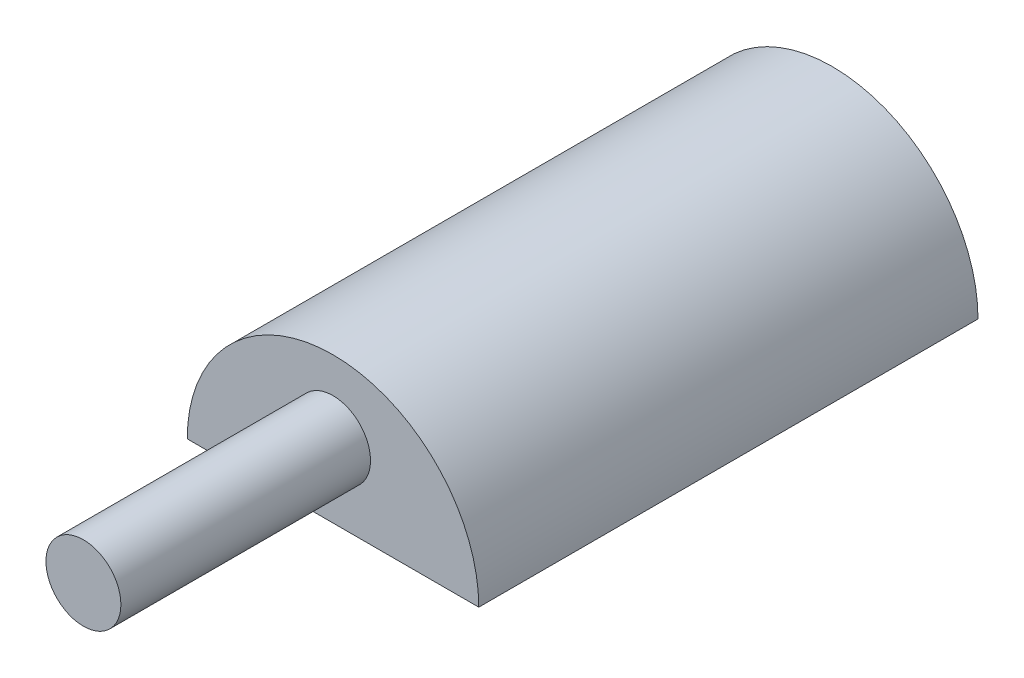
ISO-10303-21;
HEADER;
FILE_DESCRIPTION(('STEP AP214'),'2;1');
FILE_NAME('part.step','',(''),(''),'','','');
FILE_SCHEMA(('AUTOMOTIVE_DESIGN { 1 0 10303 214 1 1 1 1 }'));
ENDSEC;
DATA;
#1=APPLICATION_CONTEXT('core data for automotive mechanical design processes');
#2=APPLICATION_PROTOCOL_DEFINITION('international standard','automotive_design',2000,#1);
#3=PRODUCT_CONTEXT('',#1,'mechanical');
#4=PRODUCT('Part','Part','',(#3));
#5=PRODUCT_RELATED_PRODUCT_CATEGORY('part','',(#4));
#6=PRODUCT_DEFINITION_FORMATION('','',#4);
#7=PRODUCT_DEFINITION_CONTEXT('part definition',#1,'design');
#8=PRODUCT_DEFINITION('design','',#6,#7);
#9=PRODUCT_DEFINITION_SHAPE('','',#8);
#10=(LENGTH_UNIT() NAMED_UNIT(*) SI_UNIT(.MILLI.,.METRE.));
#11=(NAMED_UNIT(*) PLANE_ANGLE_UNIT() SI_UNIT($,.RADIAN.));
#12=(NAMED_UNIT(*) SI_UNIT($,.STERADIAN.) SOLID_ANGLE_UNIT());
#13=UNCERTAINTY_MEASURE_WITH_UNIT(LENGTH_MEASURE(1.E-05),#10,'distance_accuracy_value','');
#14=(GEOMETRIC_REPRESENTATION_CONTEXT(3) GLOBAL_UNCERTAINTY_ASSIGNED_CONTEXT((#13)) GLOBAL_UNIT_ASSIGNED_CONTEXT((#10,
#11,#12)) REPRESENTATION_CONTEXT('',''));
#15=CARTESIAN_POINT('',(0.,0.,0.));
#16=DIRECTION('',(0.,0.,1.));
#17=DIRECTION('',(1.,0.,0.));
#18=AXIS2_PLACEMENT_3D('',#15,#16,#17);
#19=CARTESIAN_POINT('',(0.,0.,254.));
#20=DIRECTION('',(0.,0.,1.));
#21=DIRECTION('',(1.,0.,0.));
#22=AXIS2_PLACEMENT_3D('',#19,#20,#21);
#23=PLANE('',#22);
#24=DIRECTION('',(1.,0.,0.));
#25=VECTOR('',#24,1.);
#26=CARTESIAN_POINT('',(0.,0.,254.));
#27=LINE('',#26,#25);
#28=CARTESIAN_POINT('',(-74.168,0.,254.));
#29=VERTEX_POINT('',#28);
#30=CARTESIAN_POINT('',(74.168,0.,254.));
#31=VERTEX_POINT('',#30);
#32=EDGE_CURVE('E50',#29,#31,#27,.T.);
#33=ORIENTED_EDGE('',*,*,#32,.T.);
#34=CARTESIAN_POINT('',(0.,0.,254.));
#35=DIRECTION('',(0.,0.,1.));
#36=DIRECTION('',(1.,0.,0.));
#37=AXIS2_PLACEMENT_3D('',#34,#35,#36);
#38=CIRCLE('',#37,74.168);
#39=EDGE_CURVE('E67',#31,#29,#38,.T.);
#40=ORIENTED_EDGE('',*,*,#39,.T.);
#41=EDGE_LOOP('',(#33,#40));
#42=FACE_BOUND('',#41,.T.);
#43=CARTESIAN_POINT('',(0.,37.084,254.));
#44=DIRECTION('',(0.,0.,1.));
#45=DIRECTION('',(1.,0.,0.));
#46=AXIS2_PLACEMENT_3D('',#43,#44,#45);
#47=CIRCLE('',#46,19.069720966897);
#48=CARTESIAN_POINT('',(19.069720966897,37.084,254.));
#49=VERTEX_POINT('',#48);
#50=EDGE_CURVE('E73',#49,#49,#47,.T.);
#51=ORIENTED_EDGE('',*,*,#50,.F.);
#52=EDGE_LOOP('',(#51));
#53=FACE_BOUND('',#52,.T.);
#54=ADVANCED_FACE('F33',(#42,#53),#23,.T.);
#55=CARTESIAN_POINT('',(0.,0.,254.));
#56=DIRECTION('',(0.,0.,-1.));
#57=DIRECTION('',(-1.,0.,0.));
#58=AXIS2_PLACEMENT_3D('',#55,#56,#57);
#59=CYLINDRICAL_SURFACE('',#58,74.168);
#60=CARTESIAN_POINT('',(0.,0.,0.));
#61=DIRECTION('',(0.,0.,1.));
#62=DIRECTION('',(1.,0.,0.));
#63=AXIS2_PLACEMENT_3D('',#60,#61,#62);
#64=CIRCLE('',#63,74.168);
#65=CARTESIAN_POINT('',(74.168,0.,0.));
#66=VERTEX_POINT('',#65);
#67=CARTESIAN_POINT('',(-74.168,0.,0.));
#68=VERTEX_POINT('',#67);
#69=EDGE_CURVE('E62',#66,#68,#64,.T.);
#70=ORIENTED_EDGE('',*,*,#69,.T.);
#71=DIRECTION('',(0.,0.,-1.));
#72=VECTOR('',#71,1.);
#73=CARTESIAN_POINT('',(-74.168,0.,254.));
#74=LINE('',#73,#72);
#75=EDGE_CURVE('E42',#29,#68,#74,.T.);
#76=ORIENTED_EDGE('',*,*,#75,.F.);
#77=ORIENTED_EDGE('',*,*,#39,.F.);
#78=DIRECTION('',(0.,0.,-1.));
#79=VECTOR('',#78,1.);
#80=CARTESIAN_POINT('',(74.168,0.,254.));
#81=LINE('',#80,#79);
#82=EDGE_CURVE('E11',#31,#66,#81,.T.);
#83=ORIENTED_EDGE('',*,*,#82,.T.);
#84=EDGE_LOOP('',(#70,#76,#77,#83));
#85=FACE_BOUND('',#84,.T.);
#86=ADVANCED_FACE('F35',(#85),#59,.T.);
#87=CARTESIAN_POINT('',(0.,0.,254.));
#88=DIRECTION('',(0.,1.,0.));
#89=DIRECTION('',(0.,0.,1.));
#90=AXIS2_PLACEMENT_3D('',#87,#88,#89);
#91=PLANE('',#90);
#92=DIRECTION('',(1.,0.,0.));
#93=VECTOR('',#92,1.);
#94=CARTESIAN_POINT('',(0.,0.,0.));
#95=LINE('',#94,#93);
#96=EDGE_CURVE('E57',#68,#66,#95,.T.);
#97=ORIENTED_EDGE('',*,*,#96,.T.);
#98=ORIENTED_EDGE('',*,*,#82,.F.);
#99=ORIENTED_EDGE('',*,*,#32,.F.);
#100=ORIENTED_EDGE('',*,*,#75,.T.);
#101=EDGE_LOOP('',(#97,#98,#99,#100));
#102=FACE_BOUND('',#101,.T.);
#103=ADVANCED_FACE('F66',(#102),#91,.F.);
#104=CARTESIAN_POINT('',(0.,0.,0.));
#105=DIRECTION('',(0.,0.,1.));
#106=DIRECTION('',(1.,0.,0.));
#107=AXIS2_PLACEMENT_3D('',#104,#105,#106);
#108=PLANE('',#107);
#109=ORIENTED_EDGE('',*,*,#69,.F.);
#110=ORIENTED_EDGE('',*,*,#96,.F.);
#111=EDGE_LOOP('',(#109,#110));
#112=FACE_BOUND('',#111,.T.);
#113=ADVANCED_FACE('F68',(#112),#108,.F.);
#114=CARTESIAN_POINT('',(0.,37.084,381.));
#115=DIRECTION('',(0.,0.,-1.));
#116=DIRECTION('',(-1.,0.,0.));
#117=AXIS2_PLACEMENT_3D('',#114,#115,#116);
#118=CYLINDRICAL_SURFACE('',#117,19.069720966897);
#119=CARTESIAN_POINT('',(0.,37.084,381.));
#120=DIRECTION('',(0.,0.,1.));
#121=DIRECTION('',(1.,0.,0.));
#122=AXIS2_PLACEMENT_3D('',#119,#120,#121);
#123=CIRCLE('',#122,19.069720966897);
#124=CARTESIAN_POINT('',(19.069720966897,37.084,381.));
#125=VERTEX_POINT('',#124);
#126=EDGE_CURVE('E64',#125,#125,#123,.T.);
#127=ORIENTED_EDGE('',*,*,#126,.F.);
#128=EDGE_LOOP('',(#127));
#129=FACE_BOUND('',#128,.T.);
#130=ORIENTED_EDGE('',*,*,#50,.T.);
#131=EDGE_LOOP('',(#130));
#132=FACE_BOUND('',#131,.T.);
#133=ADVANCED_FACE('F81',(#129,#132),#118,.T.);
#134=CARTESIAN_POINT('',(0.,37.084,381.));
#135=DIRECTION('',(0.,0.,1.));
#136=DIRECTION('',(1.,0.,0.));
#137=AXIS2_PLACEMENT_3D('',#134,#135,#136);
#138=PLANE('',#137);
#139=ORIENTED_EDGE('',*,*,#126,.T.);
#140=EDGE_LOOP('',(#139));
#141=FACE_BOUND('',#140,.T.);
#142=ADVANCED_FACE('F79',(#141),#138,.T.);
#143=CLOSED_SHELL('',(#54,#86,#103,#113,#133,#142));
#144=MANIFOLD_SOLID_BREP('B2',#143);
#145=ADVANCED_BREP_SHAPE_REPRESENTATION('',(#18,#144),#14);
#146=SHAPE_DEFINITION_REPRESENTATION(#9,#145);
ENDSEC;
END-ISO-10303-21;
